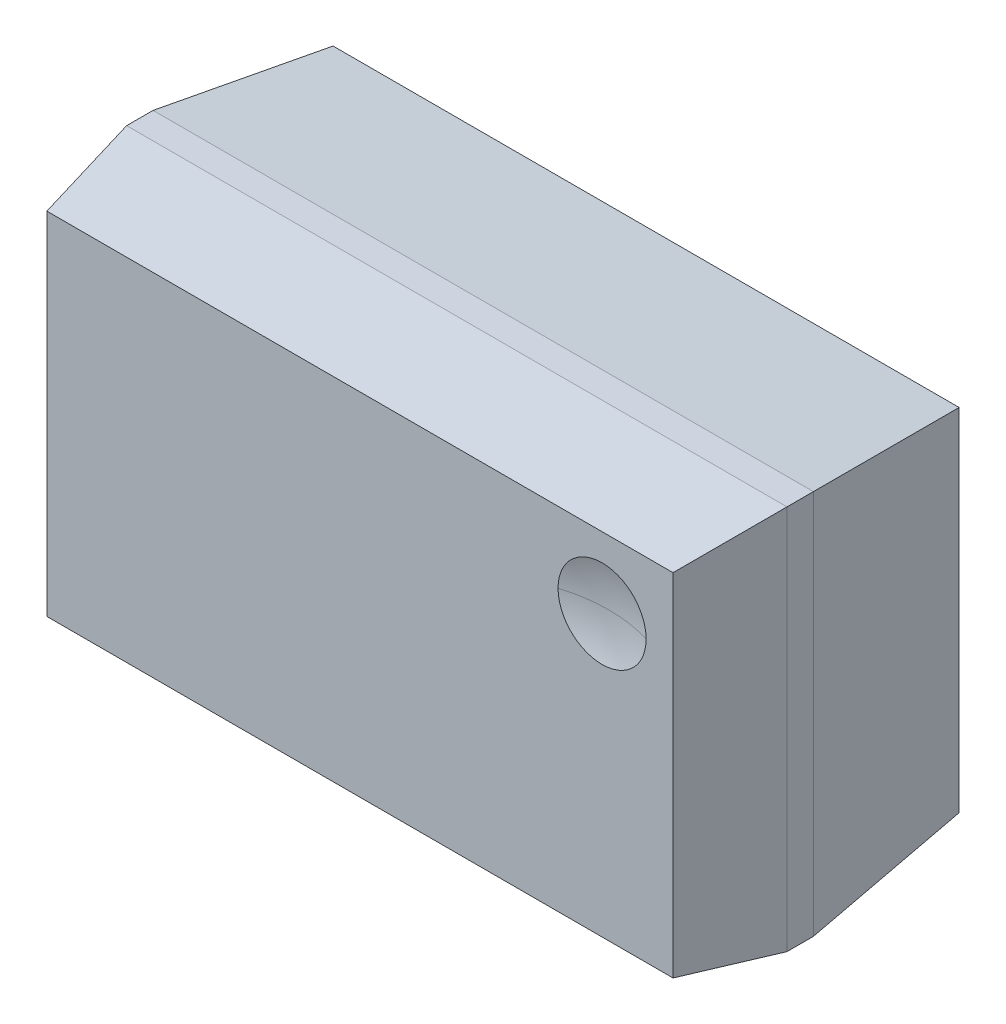
ISO-10303-21;
HEADER;
FILE_DESCRIPTION(('STEP AP214'),'2;1');
FILE_NAME('part.step','',(''),(''),'','','');
FILE_SCHEMA(('AUTOMOTIVE_DESIGN { 1 0 10303 214 1 1 1 1 }'));
ENDSEC;
DATA;
#1=APPLICATION_CONTEXT('core data for automotive mechanical design processes');
#2=APPLICATION_PROTOCOL_DEFINITION('international standard','automotive_design',2000,#1);
#3=PRODUCT_CONTEXT('',#1,'mechanical');
#4=PRODUCT('Part','Part','',(#3));
#5=PRODUCT_RELATED_PRODUCT_CATEGORY('part','',(#4));
#6=PRODUCT_DEFINITION_FORMATION('','',#4);
#7=PRODUCT_DEFINITION_CONTEXT('part definition',#1,'design');
#8=PRODUCT_DEFINITION('design','',#6,#7);
#9=PRODUCT_DEFINITION_SHAPE('','',#8);
#10=(LENGTH_UNIT() NAMED_UNIT(*) SI_UNIT(.MILLI.,.METRE.));
#11=(NAMED_UNIT(*) PLANE_ANGLE_UNIT() SI_UNIT($,.RADIAN.));
#12=(NAMED_UNIT(*) SI_UNIT($,.STERADIAN.) SOLID_ANGLE_UNIT());
#13=UNCERTAINTY_MEASURE_WITH_UNIT(LENGTH_MEASURE(1.E-05),#10,'distance_accuracy_value','');
#14=(GEOMETRIC_REPRESENTATION_CONTEXT(3) GLOBAL_UNCERTAINTY_ASSIGNED_CONTEXT((#13)) GLOBAL_UNIT_ASSIGNED_CONTEXT((#10,
#11,#12)) REPRESENTATION_CONTEXT('',''));
#15=CARTESIAN_POINT('',(0.,0.,0.));
#16=DIRECTION('',(0.,0.,1.));
#17=DIRECTION('',(1.,0.,0.));
#18=AXIS2_PLACEMENT_3D('',#15,#16,#17);
#19=CARTESIAN_POINT('',(-1.5,-0.875,-0.8));
#20=DIRECTION('',(0.,0.,1.));
#21=DIRECTION('',(1.,0.,0.));
#22=AXIS2_PLACEMENT_3D('',#19,#20,#21);
#23=PLANE('',#22);
#24=DIRECTION('',(0.,1.,0.));
#25=VECTOR('',#24,1.);
#26=CARTESIAN_POINT('',(1.422222865903,0.875,-0.8));
#27=LINE('',#26,#25);
#28=CARTESIAN_POINT('',(1.422222865903,-0.797222865903,-0.8));
#29=VERTEX_POINT('',#28);
#30=CARTESIAN_POINT('',(1.422222865903,0.797222865903,-0.8));
#31=VERTEX_POINT('',#30);
#32=EDGE_CURVE('E20',#29,#31,#27,.T.);
#33=ORIENTED_EDGE('',*,*,#32,.F.);
#34=DIRECTION('',(1.,0.,0.));
#35=VECTOR('',#34,1.);
#36=CARTESIAN_POINT('',(-1.5,-0.797222865903,-0.8));
#37=LINE('',#36,#35);
#38=CARTESIAN_POINT('',(-1.422222865903,-0.797222865903,-0.8));
#39=VERTEX_POINT('',#38);
#40=EDGE_CURVE('E27',#39,#29,#37,.T.);
#41=ORIENTED_EDGE('',*,*,#40,.F.);
#42=DIRECTION('',(0.,-1.,0.));
#43=VECTOR('',#42,1.);
#44=CARTESIAN_POINT('',(-1.422222865903,0.875,-0.8));
#45=LINE('',#44,#43);
#46=CARTESIAN_POINT('',(-1.422222865903,0.797222865903,-0.8));
#47=VERTEX_POINT('',#46);
#48=EDGE_CURVE('E114',#47,#39,#45,.T.);
#49=ORIENTED_EDGE('',*,*,#48,.F.);
#50=DIRECTION('',(-1.,0.,0.));
#51=VECTOR('',#50,1.);
#52=CARTESIAN_POINT('',(-1.5,0.797222865903,-0.8));
#53=LINE('',#52,#51);
#54=EDGE_CURVE('E11',#31,#47,#53,.T.);
#55=ORIENTED_EDGE('',*,*,#54,.F.);
#56=EDGE_LOOP('',(#33,#41,#49,#55));
#57=FACE_BOUND('',#56,.T.);
#58=ADVANCED_FACE('F16',(#57),#23,.F.);
#59=CARTESIAN_POINT('',(-1.5,0.875,-0.05999999999998));
#60=DIRECTION('',(0.,0.994521895368234,-0.104528463268025));
#61=DIRECTION('',(-1.,0.,0.));
#62=AXIS2_PLACEMENT_3D('',#59,#60,#61);
#63=PLANE('',#62);
#64=DIRECTION('',(0.103962051183996,0.103962051183996,0.989132844377959));
#65=VECTOR('',#64,1.);
#66=CARTESIAN_POINT('',(1.422222865903,0.797222865903,-0.8));
#67=LINE('',#66,#65);
#68=CARTESIAN_POINT('',(1.5,0.875,-0.05999999999998));
#69=VERTEX_POINT('',#68);
#70=EDGE_CURVE('E173',#31,#69,#67,.T.);
#71=ORIENTED_EDGE('',*,*,#70,.F.);
#72=ORIENTED_EDGE('',*,*,#54,.T.);
#73=DIRECTION('',(0.103962051183996,-0.103962051183996,-0.989132844377959));
#74=VECTOR('',#73,1.);
#75=CARTESIAN_POINT('',(-1.5,0.875,-0.05999999999998));
#76=LINE('',#75,#74);
#77=CARTESIAN_POINT('',(-1.5,0.875,-0.05999999999998));
#78=VERTEX_POINT('',#77);
#79=EDGE_CURVE('E124',#78,#47,#76,.T.);
#80=ORIENTED_EDGE('',*,*,#79,.F.);
#81=DIRECTION('',(1.,0.,0.));
#82=VECTOR('',#81,1.);
#83=CARTESIAN_POINT('',(-1.5,0.875,-0.05999999999998));
#84=LINE('',#83,#82);
#85=EDGE_CURVE('E81',#78,#69,#84,.T.);
#86=ORIENTED_EDGE('',*,*,#85,.T.);
#87=EDGE_LOOP('',(#71,#72,#80,#86));
#88=FACE_BOUND('',#87,.T.);
#89=ADVANCED_FACE('F18',(#88),#63,.T.);
#90=CARTESIAN_POINT('',(-1.5,-0.875,-0.05999999999998));
#91=DIRECTION('',(0.,-0.994521895368234,-0.104528463268025));
#92=DIRECTION('',(0.,0.104528463268025,-0.994521895368234));
#93=AXIS2_PLACEMENT_3D('',#90,#91,#92);
#94=PLANE('',#93);
#95=DIRECTION('',(-0.103962051183996,0.103962051183996,-0.989132844377959));
#96=VECTOR('',#95,1.);
#97=CARTESIAN_POINT('',(1.5,-0.875,-0.05999999999998));
#98=LINE('',#97,#96);
#99=CARTESIAN_POINT('',(1.5,-0.875,-0.05999999999998));
#100=VERTEX_POINT('',#99);
#101=EDGE_CURVE('E141',#100,#29,#98,.T.);
#102=ORIENTED_EDGE('',*,*,#101,.F.);
#103=DIRECTION('',(-1.,0.,0.));
#104=VECTOR('',#103,1.);
#105=CARTESIAN_POINT('',(-1.5,-0.875,-0.05999999999998));
#106=LINE('',#105,#104);
#107=CARTESIAN_POINT('',(-1.5,-0.875,-0.05999999999998));
#108=VERTEX_POINT('',#107);
#109=EDGE_CURVE('E129',#100,#108,#106,.T.);
#110=ORIENTED_EDGE('',*,*,#109,.T.);
#111=DIRECTION('',(-0.103962051183996,-0.103962051183996,0.989132844377959));
#112=VECTOR('',#111,1.);
#113=CARTESIAN_POINT('',(-1.422222865903,-0.797222865903,-0.8));
#114=LINE('',#113,#112);
#115=EDGE_CURVE('E123',#39,#108,#114,.T.);
#116=ORIENTED_EDGE('',*,*,#115,.F.);
#117=ORIENTED_EDGE('',*,*,#40,.T.);
#118=EDGE_LOOP('',(#102,#110,#116,#117));
#119=FACE_BOUND('',#118,.T.);
#120=ADVANCED_FACE('F128',(#119),#94,.T.);
#121=CARTESIAN_POINT('',(-1.5,0.875,-0.8));
#122=DIRECTION('',(0.,1.,0.));
#123=DIRECTION('',(1.,0.,0.));
#124=AXIS2_PLACEMENT_3D('',#121,#122,#123);
#125=PLANE('',#124);
#126=DIRECTION('',(0.,0.,-1.));
#127=VECTOR('',#126,1.);
#128=CARTESIAN_POINT('',(-1.5,0.875,-0.8));
#129=LINE('',#128,#127);
#130=CARTESIAN_POINT('',(-1.5,0.875,0.05999999999999));
#131=VERTEX_POINT('',#130);
#132=EDGE_CURVE('E187',#131,#78,#129,.T.);
#133=ORIENTED_EDGE('',*,*,#132,.F.);
#134=DIRECTION('',(1.,0.,0.));
#135=VECTOR('',#134,1.);
#136=CARTESIAN_POINT('',(-1.5,0.875,0.05999999999999));
#137=LINE('',#136,#135);
#138=CARTESIAN_POINT('',(1.5,0.875,0.05999999999999));
#139=VERTEX_POINT('',#138);
#140=EDGE_CURVE('E158',#131,#139,#137,.T.);
#141=ORIENTED_EDGE('',*,*,#140,.T.);
#142=DIRECTION('',(0.,0.,1.));
#143=VECTOR('',#142,1.);
#144=CARTESIAN_POINT('',(1.5,0.875,-0.8));
#145=LINE('',#144,#143);
#146=EDGE_CURVE('E126',#69,#139,#145,.T.);
#147=ORIENTED_EDGE('',*,*,#146,.F.);
#148=ORIENTED_EDGE('',*,*,#85,.F.);
#149=EDGE_LOOP('',(#133,#141,#147,#148));
#150=FACE_BOUND('',#149,.T.);
#151=ADVANCED_FACE('F285',(#150),#125,.T.);
#152=CARTESIAN_POINT('',(-1.5,-0.875,-0.8));
#153=DIRECTION('',(0.,-1.,0.));
#154=DIRECTION('',(0.,0.,-1.));
#155=AXIS2_PLACEMENT_3D('',#152,#153,#154);
#156=PLANE('',#155);
#157=DIRECTION('',(0.,0.,-1.));
#158=VECTOR('',#157,1.);
#159=CARTESIAN_POINT('',(1.5,-0.875,-0.8));
#160=LINE('',#159,#158);
#161=CARTESIAN_POINT('',(1.5,-0.875,0.05999999999999));
#162=VERTEX_POINT('',#161);
#163=EDGE_CURVE('E178',#162,#100,#160,.T.);
#164=ORIENTED_EDGE('',*,*,#163,.F.);
#165=DIRECTION('',(-1.,0.,0.));
#166=VECTOR('',#165,1.);
#167=CARTESIAN_POINT('',(-1.5,-0.875,0.05999999999999));
#168=LINE('',#167,#166);
#169=CARTESIAN_POINT('',(-1.5,-0.875,0.05999999999999));
#170=VERTEX_POINT('',#169);
#171=EDGE_CURVE('E161',#162,#170,#168,.T.);
#172=ORIENTED_EDGE('',*,*,#171,.T.);
#173=DIRECTION('',(0.,0.,1.));
#174=VECTOR('',#173,1.);
#175=CARTESIAN_POINT('',(-1.5,-0.875,-0.8));
#176=LINE('',#175,#174);
#177=EDGE_CURVE('E182',#108,#170,#176,.T.);
#178=ORIENTED_EDGE('',*,*,#177,.F.);
#179=ORIENTED_EDGE('',*,*,#109,.F.);
#180=EDGE_LOOP('',(#164,#172,#178,#179));
#181=FACE_BOUND('',#180,.T.);
#182=ADVANCED_FACE('F282',(#181),#156,.T.);
#183=CARTESIAN_POINT('',(-1.5,0.797416128488,0.5));
#184=DIRECTION('',(0.,-0.98480775301219,-0.173648177667033));
#185=DIRECTION('',(0.,0.173648177667033,-0.98480775301219));
#186=AXIS2_PLACEMENT_3D('',#183,#184,#185);
#187=PLANE('',#186);
#188=DIRECTION('',(-1.,0.,0.));
#189=VECTOR('',#188,1.);
#190=CARTESIAN_POINT('',(-1.5,0.797416128488,0.5));
#191=LINE('',#190,#189);
#192=CARTESIAN_POINT('',(1.422416128488,0.797416128488,0.5));
#193=VERTEX_POINT('',#192);
#194=CARTESIAN_POINT('',(-1.422416128488,0.797416128488,0.5));
#195=VERTEX_POINT('',#194);
#196=EDGE_CURVE('E41',#193,#195,#191,.T.);
#197=ORIENTED_EDGE('',*,*,#196,.F.);
#198=DIRECTION('',(0.171087869745971,0.171087869745971,-0.970287525247837));
#199=VECTOR('',#198,1.);
#200=CARTESIAN_POINT('',(1.422416128488,0.797416128488,0.5));
#201=LINE('',#200,#199);
#202=EDGE_CURVE('E149',#193,#139,#201,.T.);
#203=ORIENTED_EDGE('',*,*,#202,.T.);
#204=ORIENTED_EDGE('',*,*,#140,.F.);
#205=DIRECTION('',(0.171087869745971,-0.171087869745971,0.970287525247837));
#206=VECTOR('',#205,1.);
#207=CARTESIAN_POINT('',(-1.5,0.875,0.05999999999999));
#208=LINE('',#207,#206);
#209=EDGE_CURVE('E169',#131,#195,#208,.T.);
#210=ORIENTED_EDGE('',*,*,#209,.T.);
#211=EDGE_LOOP('',(#197,#203,#204,#210));
#212=FACE_BOUND('',#211,.T.);
#213=ADVANCED_FACE('F279',(#212),#187,.F.);
#214=CARTESIAN_POINT('',(-1.5,-0.797416128488,0.5));
#215=DIRECTION('',(0.,0.98480775301219,-0.173648177667033));
#216=DIRECTION('',(-1.,0.,0.));
#217=AXIS2_PLACEMENT_3D('',#214,#215,#216);
#218=PLANE('',#217);
#219=ORIENTED_EDGE('',*,*,#171,.F.);
#220=DIRECTION('',(-0.171087869745971,0.171087869745971,0.970287525247837));
#221=VECTOR('',#220,1.);
#222=CARTESIAN_POINT('',(1.5,-0.875,0.05999999999999));
#223=LINE('',#222,#221);
#224=CARTESIAN_POINT('',(1.422416128488,-0.797416128488,0.5));
#225=VERTEX_POINT('',#224);
#226=EDGE_CURVE('E148',#162,#225,#223,.T.);
#227=ORIENTED_EDGE('',*,*,#226,.T.);
#228=DIRECTION('',(1.,0.,0.));
#229=VECTOR('',#228,1.);
#230=CARTESIAN_POINT('',(-1.5,-0.797416128488,0.5));
#231=LINE('',#230,#229);
#232=CARTESIAN_POINT('',(-1.422416128488,-0.797416128488,0.5));
#233=VERTEX_POINT('',#232);
#234=EDGE_CURVE('E168',#233,#225,#231,.T.);
#235=ORIENTED_EDGE('',*,*,#234,.F.);
#236=DIRECTION('',(-0.171087869745971,-0.171087869745971,-0.970287525247837));
#237=VECTOR('',#236,1.);
#238=CARTESIAN_POINT('',(-1.422416128488,-0.797416128488,0.5));
#239=LINE('',#238,#237);
#240=EDGE_CURVE('E192',#233,#170,#239,.T.);
#241=ORIENTED_EDGE('',*,*,#240,.T.);
#242=EDGE_LOOP('',(#219,#227,#235,#241));
#243=FACE_BOUND('',#242,.T.);
#244=ADVANCED_FACE('F222',(#243),#218,.F.);
#245=CARTESIAN_POINT('',(-1.5,-0.875,0.5));
#246=DIRECTION('',(0.,0.,1.));
#247=DIRECTION('',(1.,0.,0.));
#248=AXIS2_PLACEMENT_3D('',#245,#246,#247);
#249=PLANE('',#248);
#250=CARTESIAN_POINT('',(1.1,0.475,0.5));
#251=DIRECTION('',(0.,0.,-1.));
#252=DIRECTION('',(-1.,0.,0.));
#253=AXIS2_PLACEMENT_3D('',#250,#251,#252);
#254=CIRCLE('',#253,0.2);
#255=CARTESIAN_POINT('',(0.9,0.475,0.5));
#256=VERTEX_POINT('',#255);
#257=CARTESIAN_POINT('',(1.3,0.475,0.5));
#258=VERTEX_POINT('',#257);
#259=EDGE_CURVE('E156',#256,#258,#254,.T.);
#260=ORIENTED_EDGE('',*,*,#259,.T.);
#261=CARTESIAN_POINT('',(1.1,0.475,0.5));
#262=DIRECTION('',(0.,0.,-1.));
#263=DIRECTION('',(-1.,0.,0.));
#264=AXIS2_PLACEMENT_3D('',#261,#262,#263);
#265=CIRCLE('',#264,0.2);
#266=EDGE_CURVE('E165',#258,#256,#265,.T.);
#267=ORIENTED_EDGE('',*,*,#266,.T.);
#268=EDGE_LOOP('',(#260,#267));
#269=FACE_BOUND('',#268,.T.);
#270=ORIENTED_EDGE('',*,*,#196,.T.);
#271=DIRECTION('',(0.,-1.,0.));
#272=VECTOR('',#271,1.);
#273=CARTESIAN_POINT('',(-1.422416128488,-0.875,0.5));
#274=LINE('',#273,#272);
#275=EDGE_CURVE('E196',#195,#233,#274,.T.);
#276=ORIENTED_EDGE('',*,*,#275,.T.);
#277=ORIENTED_EDGE('',*,*,#234,.T.);
#278=DIRECTION('',(0.,1.,0.));
#279=VECTOR('',#278,1.);
#280=CARTESIAN_POINT('',(1.422416128488,-0.875,0.5));
#281=LINE('',#280,#279);
#282=EDGE_CURVE('E145',#225,#193,#281,.T.);
#283=ORIENTED_EDGE('',*,*,#282,.T.);
#284=EDGE_LOOP('',(#270,#276,#277,#283));
#285=FACE_BOUND('',#284,.T.);
#286=ADVANCED_FACE('F213',(#269,#285),#249,.T.);
#287=CARTESIAN_POINT('',(-1.422416128488,-0.875,0.5));
#288=DIRECTION('',(0.98480775301219,0.,-0.173648177667033));
#289=DIRECTION('',(0.,-1.,0.));
#290=AXIS2_PLACEMENT_3D('',#287,#288,#289);
#291=PLANE('',#290);
#292=DIRECTION('',(0.,1.,0.));
#293=VECTOR('',#292,1.);
#294=CARTESIAN_POINT('',(-1.5,-0.875,0.05999999999999));
#295=LINE('',#294,#293);
#296=EDGE_CURVE('E190',#170,#131,#295,.T.);
#297=ORIENTED_EDGE('',*,*,#296,.F.);
#298=ORIENTED_EDGE('',*,*,#240,.F.);
#299=ORIENTED_EDGE('',*,*,#275,.F.);
#300=ORIENTED_EDGE('',*,*,#209,.F.);
#301=EDGE_LOOP('',(#297,#298,#299,#300));
#302=FACE_BOUND('',#301,.T.);
#303=ADVANCED_FACE('F218',(#302),#291,.F.);
#304=CARTESIAN_POINT('',(1.422416128488,-0.875,0.5));
#305=DIRECTION('',(-0.98480775301219,0.,-0.173648177667033));
#306=DIRECTION('',(-0.173648177667033,0.,0.98480775301219));
#307=AXIS2_PLACEMENT_3D('',#304,#305,#306);
#308=PLANE('',#307);
#309=DIRECTION('',(0.,-1.,0.));
#310=VECTOR('',#309,1.);
#311=CARTESIAN_POINT('',(1.5,-0.875,0.05999999999999));
#312=LINE('',#311,#310);
#313=EDGE_CURVE('E183',#139,#162,#312,.T.);
#314=ORIENTED_EDGE('',*,*,#313,.F.);
#315=ORIENTED_EDGE('',*,*,#202,.F.);
#316=ORIENTED_EDGE('',*,*,#282,.F.);
#317=ORIENTED_EDGE('',*,*,#226,.F.);
#318=EDGE_LOOP('',(#314,#315,#316,#317));
#319=FACE_BOUND('',#318,.T.);
#320=ADVANCED_FACE('F253',(#319),#308,.F.);
#321=CARTESIAN_POINT('',(1.1,0.475,0.470007754703));
#322=CARTESIAN_POINT('',(1.1,0.475,0.470007754703));
#323=CARTESIAN_POINT('',(1.1,0.475,0.470007754703));
#324=CARTESIAN_POINT('',(1.1,0.475,0.470007754703));
#325=CARTESIAN_POINT('',(1.167945291522,0.475,0.469678505776));
#326=CARTESIAN_POINT('',(1.167945291522,0.339109416956,0.469678505776));
#327=CARTESIAN_POINT('',(1.032054708478,0.339109416956,0.469678505776));
#328=CARTESIAN_POINT('',(1.032054708478,0.475,0.469678505776));
#329=CARTESIAN_POINT('',(1.235140031379,0.475,0.479755111378));
#330=CARTESIAN_POINT('',(1.235140031379,0.204719937243,0.479755111378));
#331=CARTESIAN_POINT('',(0.964859968621,0.204719937243,0.479755111378));
#332=CARTESIAN_POINT('',(0.964859968621,0.475,0.479755111378));
#333=CARTESIAN_POINT('',(1.3,0.475,0.5));
#334=CARTESIAN_POINT('',(1.3,0.075,0.5));
#335=CARTESIAN_POINT('',(0.9,0.075,0.5));
#336=CARTESIAN_POINT('',(0.9,0.475,0.5));
#337=(BOUNDED_SURFACE() B_SPLINE_SURFACE(3,3,((#321,#322,#323,#324),(#325,#326,#327,#328),(#329,
#330,#331,#332),(#333,#334,#335,#336)),.UNSPECIFIED.,.F.,.F.,
.F.) B_SPLINE_SURFACE_WITH_KNOTS((4,4),(4,4),(0.,1.),(0.,1.),
.UNSPECIFIED.) GEOMETRIC_REPRESENTATION_ITEM() RATIONAL_B_SPLINE_SURFACE(((1.,0.333333333333,
0.333333333333,1.),(0.992141152848,0.330713717616,0.330713717616,0.992141152848),
(0.992141152848,0.330713717616,0.330713717616,0.992141152848),(1.,0.333333333333,0.333333333333,1.))) REPRESENTATION_ITEM('') SURFACE());
#338=CARTESIAN_POINT('',(1.103200609757,0.475,1.1305));
#339=DIRECTION('',(0.,-1.,0.));
#340=DIRECTION('',(1.,0.,0.));
#341=AXIS2_PLACEMENT_3D('',#338,#339,#340);
#342=CIRCLE('',#341,0.6605);
#343=CARTESIAN_POINT('',(1.1,0.475,0.47));
#344=VERTEX_POINT('',#343);
#345=EDGE_CURVE('E152',#344,#258,#342,.T.);
#346=CARTESIAN_POINT('',(1.096799390243,0.475,1.1305));
#347=DIRECTION('',(0.,1.,0.));
#348=DIRECTION('',(-1.,0.,0.));
#349=AXIS2_PLACEMENT_3D('',#346,#347,#348);
#350=CIRCLE('',#349,0.6605);
#351=EDGE_CURVE('E157',#344,#256,#350,.T.);
#352=ORIENTED_EDGE('',*,*,#345,.F.);
#353=ORIENTED_EDGE('',*,*,#351,.T.);
#354=ORIENTED_EDGE('',*,*,#266,.F.);
#355=EDGE_LOOP('',(#352,#353,#354));
#356=FACE_BOUND('',#355,.T.);
#357=ADVANCED_FACE('F250',(#356),#337,.F.);
#358=CARTESIAN_POINT('',(-1.5,0.875,-0.8));
#359=DIRECTION('',(-1.,0.,0.));
#360=DIRECTION('',(0.,0.,1.));
#361=AXIS2_PLACEMENT_3D('',#358,#359,#360);
#362=PLANE('',#361);
#363=ORIENTED_EDGE('',*,*,#177,.T.);
#364=ORIENTED_EDGE('',*,*,#296,.T.);
#365=ORIENTED_EDGE('',*,*,#132,.T.);
#366=DIRECTION('',(0.,-1.,0.));
#367=VECTOR('',#366,1.);
#368=CARTESIAN_POINT('',(-1.5,0.875,-0.05999999999998));
#369=LINE('',#368,#367);
#370=EDGE_CURVE('E132',#78,#108,#369,.T.);
#371=ORIENTED_EDGE('',*,*,#370,.T.);
#372=EDGE_LOOP('',(#363,#364,#365,#371));
#373=FACE_BOUND('',#372,.T.);
#374=ADVANCED_FACE('F252',(#373),#362,.T.);
#375=CARTESIAN_POINT('',(1.5,0.875,-0.8));
#376=DIRECTION('',(1.,0.,0.));
#377=DIRECTION('',(0.,1.,0.));
#378=AXIS2_PLACEMENT_3D('',#375,#376,#377);
#379=PLANE('',#378);
#380=ORIENTED_EDGE('',*,*,#146,.T.);
#381=ORIENTED_EDGE('',*,*,#313,.T.);
#382=ORIENTED_EDGE('',*,*,#163,.T.);
#383=DIRECTION('',(0.,1.,0.));
#384=VECTOR('',#383,1.);
#385=CARTESIAN_POINT('',(1.5,0.875,-0.05999999999998));
#386=LINE('',#385,#384);
#387=EDGE_CURVE('E177',#100,#69,#386,.T.);
#388=ORIENTED_EDGE('',*,*,#387,.T.);
#389=EDGE_LOOP('',(#380,#381,#382,#388));
#390=FACE_BOUND('',#389,.T.);
#391=ADVANCED_FACE('F260',(#390),#379,.T.);
#392=CARTESIAN_POINT('',(-1.5,0.875,-0.05999999999998));
#393=DIRECTION('',(-0.994521895368234,0.,-0.104528463268025));
#394=DIRECTION('',(-0.104528463268025,0.,0.994521895368234));
#395=AXIS2_PLACEMENT_3D('',#392,#393,#394);
#396=PLANE('',#395);
#397=ORIENTED_EDGE('',*,*,#115,.T.);
#398=ORIENTED_EDGE('',*,*,#370,.F.);
#399=ORIENTED_EDGE('',*,*,#79,.T.);
#400=ORIENTED_EDGE('',*,*,#48,.T.);
#401=EDGE_LOOP('',(#397,#398,#399,#400));
#402=FACE_BOUND('',#401,.T.);
#403=ADVANCED_FACE('F121',(#402),#396,.T.);
#404=CARTESIAN_POINT('',(1.5,0.875,-0.05999999999998));
#405=DIRECTION('',(0.994521895368234,0.,-0.104528463268025));
#406=DIRECTION('',(0.,-1.,0.));
#407=AXIS2_PLACEMENT_3D('',#404,#405,#406);
#408=PLANE('',#407);
#409=ORIENTED_EDGE('',*,*,#70,.T.);
#410=ORIENTED_EDGE('',*,*,#387,.F.);
#411=ORIENTED_EDGE('',*,*,#101,.T.);
#412=ORIENTED_EDGE('',*,*,#32,.T.);
#413=EDGE_LOOP('',(#409,#410,#411,#412));
#414=FACE_BOUND('',#413,.T.);
#415=ADVANCED_FACE('F278',(#414),#408,.T.);
#416=CARTESIAN_POINT('',(1.1,0.475,0.470007754703));
#417=CARTESIAN_POINT('',(1.1,0.475,0.470007754703));
#418=CARTESIAN_POINT('',(1.1,0.475,0.470007754703));
#419=CARTESIAN_POINT('',(1.1,0.475,0.470007754703));
#420=CARTESIAN_POINT('',(1.032054708478,0.475,0.469678505776));
#421=CARTESIAN_POINT('',(1.032054708478,0.610890583044,0.469678505776));
#422=CARTESIAN_POINT('',(1.167945291522,0.610890583044,0.469678505776));
#423=CARTESIAN_POINT('',(1.167945291522,0.475,0.469678505776));
#424=CARTESIAN_POINT('',(0.964859968621,0.475,0.479755111378));
#425=CARTESIAN_POINT('',(0.964859968621,0.745280062757001,0.479755111378));
#426=CARTESIAN_POINT('',(1.235140031379,0.745280062757001,0.479755111378));
#427=CARTESIAN_POINT('',(1.235140031379,0.475,0.479755111378));
#428=CARTESIAN_POINT('',(0.9,0.475,0.5));
#429=CARTESIAN_POINT('',(0.9,0.875,0.5));
#430=CARTESIAN_POINT('',(1.3,0.875,0.5));
#431=CARTESIAN_POINT('',(1.3,0.475,0.5));
#432=(BOUNDED_SURFACE() B_SPLINE_SURFACE(3,3,((#416,#417,#418,#419),(#420,#421,#422,#423),(#424,
#425,#426,#427),(#428,#429,#430,#431)),.UNSPECIFIED.,.F.,.F.,
.F.) B_SPLINE_SURFACE_WITH_KNOTS((4,4),(4,4),(0.,1.),(0.,1.),
.UNSPECIFIED.) GEOMETRIC_REPRESENTATION_ITEM() RATIONAL_B_SPLINE_SURFACE(((1.,0.333333333333,
0.333333333333,1.),(0.992141152848,0.330713717616,0.330713717616,0.992141152848),
(0.992141152848,0.330713717616,0.330713717616,0.992141152848),(1.,0.333333333333,0.333333333333,1.))) REPRESENTATION_ITEM('') SURFACE());
#433=ORIENTED_EDGE('',*,*,#351,.F.);
#434=ORIENTED_EDGE('',*,*,#345,.T.);
#435=ORIENTED_EDGE('',*,*,#259,.F.);
#436=EDGE_LOOP('',(#433,#434,#435));
#437=FACE_BOUND('',#436,.T.);
#438=ADVANCED_FACE('F247',(#437),#432,.F.);
#439=CLOSED_SHELL('',(#58,#89,#120,#151,#182,#213,#244,#286,#303,#320,#357,#374,#391,#403,#415,#438));
#440=MANIFOLD_SOLID_BREP('B1',#439);
#441=ADVANCED_BREP_SHAPE_REPRESENTATION('',(#18,#440),#14);
#442=SHAPE_DEFINITION_REPRESENTATION(#9,#441);
ENDSEC;
END-ISO-10303-21;
